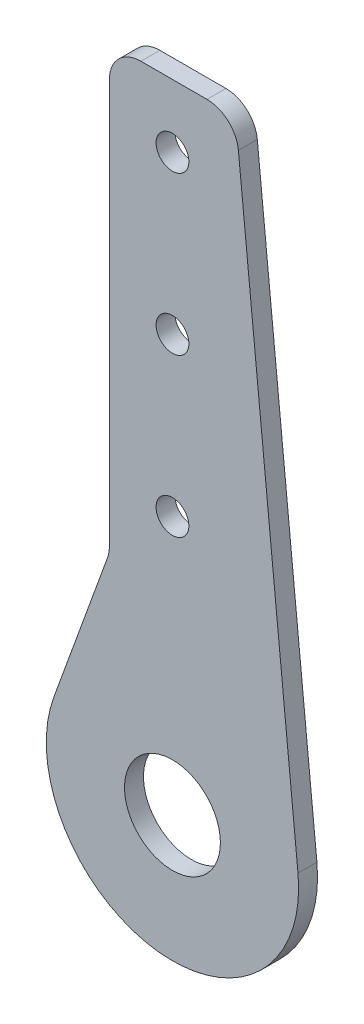
ISO-10303-21;
HEADER;
FILE_DESCRIPTION(('STEP AP214'),'2;1');
FILE_NAME('part.step','',(''),(''),'','','');
FILE_SCHEMA(('AUTOMOTIVE_DESIGN { 1 0 10303 214 1 1 1 1 }'));
ENDSEC;
DATA;
#1=APPLICATION_CONTEXT('core data for automotive mechanical design processes');
#2=APPLICATION_PROTOCOL_DEFINITION('international standard','automotive_design',2000,#1);
#3=PRODUCT_CONTEXT('',#1,'mechanical');
#4=PRODUCT('Part','Part','',(#3));
#5=PRODUCT_RELATED_PRODUCT_CATEGORY('part','',(#4));
#6=PRODUCT_DEFINITION_FORMATION('','',#4);
#7=PRODUCT_DEFINITION_CONTEXT('part definition',#1,'design');
#8=PRODUCT_DEFINITION('design','',#6,#7);
#9=PRODUCT_DEFINITION_SHAPE('','',#8);
#10=(LENGTH_UNIT() NAMED_UNIT(*) SI_UNIT(.MILLI.,.METRE.));
#11=(NAMED_UNIT(*) PLANE_ANGLE_UNIT() SI_UNIT($,.RADIAN.));
#12=(NAMED_UNIT(*) SI_UNIT($,.STERADIAN.) SOLID_ANGLE_UNIT());
#13=UNCERTAINTY_MEASURE_WITH_UNIT(LENGTH_MEASURE(1.E-05),#10,'distance_accuracy_value','');
#14=(GEOMETRIC_REPRESENTATION_CONTEXT(3) GLOBAL_UNCERTAINTY_ASSIGNED_CONTEXT((#13)) GLOBAL_UNIT_ASSIGNED_CONTEXT((#10,
#11,#12)) REPRESENTATION_CONTEXT('',''));
#15=CARTESIAN_POINT('',(0.,0.,0.));
#16=DIRECTION('',(0.,0.,1.));
#17=DIRECTION('',(1.,0.,0.));
#18=AXIS2_PLACEMENT_3D('',#15,#16,#17);
#19=CARTESIAN_POINT('',(0.,0.,3.));
#20=DIRECTION('',(0.,0.,1.));
#21=DIRECTION('',(1.,0.,0.));
#22=AXIS2_PLACEMENT_3D('',#19,#20,#21);
#23=PLANE('',#22);
#24=CARTESIAN_POINT('',(0.,91.,3.));
#25=DIRECTION('',(0.,0.,1.));
#26=DIRECTION('',(1.,0.,0.));
#27=AXIS2_PLACEMENT_3D('',#24,#25,#26);
#28=CIRCLE('',#27,2.59999999999997);
#29=CARTESIAN_POINT('',(2.59999999999997,91.,3.));
#30=VERTEX_POINT('',#29);
#31=EDGE_CURVE('E266',#30,#30,#28,.T.);
#32=ORIENTED_EDGE('',*,*,#31,.F.);
#33=EDGE_LOOP('',(#32));
#34=FACE_BOUND('',#33,.T.);
#35=CARTESIAN_POINT('',(0.,0.,3.));
#36=DIRECTION('',(0.,0.,1.));
#37=DIRECTION('',(1.,0.,0.));
#38=AXIS2_PLACEMENT_3D('',#35,#36,#37);
#39=CIRCLE('',#38,7.6);
#40=CARTESIAN_POINT('',(7.6,0.,3.));
#41=VERTEX_POINT('',#40);
#42=EDGE_CURVE('E147',#41,#41,#39,.T.);
#43=ORIENTED_EDGE('',*,*,#42,.F.);
#44=EDGE_LOOP('',(#43));
#45=FACE_BOUND('',#44,.T.);
#46=DIRECTION('',(-0.099501243789102,0.995037437730069,0.));
#47=VECTOR('',#46,1.);
#48=CARTESIAN_POINT('',(9.99999999999999,101.,3.));
#49=LINE('',#48,#47);
#50=CARTESIAN_POINT('',(19.9007487546014,1.99002487578204,3.));
#51=VERTEX_POINT('',#50);
#52=CARTESIAN_POINT('',(10.4502380658055,96.4975062189455,3.));
#53=VERTEX_POINT('',#52);
#54=EDGE_CURVE('E136',#51,#53,#49,.T.);
#55=ORIENTED_EDGE('',*,*,#54,.T.);
#56=CARTESIAN_POINT('',(5.47505087715512,96.,3.));
#57=DIRECTION('',(0.,0.,1.));
#58=DIRECTION('',(1.,0.,0.));
#59=AXIS2_PLACEMENT_3D('',#56,#57,#58);
#60=CIRCLE('',#59,5.);
#61=CARTESIAN_POINT('',(5.47505087715512,101.,3.));
#62=VERTEX_POINT('',#61);
#63=EDGE_CURVE('E180',#53,#62,#60,.T.);
#64=ORIENTED_EDGE('',*,*,#63,.T.);
#65=DIRECTION('',(-1.,0.,0.));
#66=VECTOR('',#65,1.);
#67=CARTESIAN_POINT('',(-10.,101.,3.));
#68=LINE('',#67,#66);
#69=CARTESIAN_POINT('',(-5.00000000000001,101.,3.));
#70=VERTEX_POINT('',#69);
#71=EDGE_CURVE('E159',#62,#70,#68,.T.);
#72=ORIENTED_EDGE('',*,*,#71,.T.);
#73=CARTESIAN_POINT('',(-5.00000000000001,96.,3.));
#74=DIRECTION('',(0.,0.,1.));
#75=DIRECTION('',(1.,0.,0.));
#76=AXIS2_PLACEMENT_3D('',#73,#74,#75);
#77=CIRCLE('',#76,5.);
#78=CARTESIAN_POINT('',(-10.,96.,3.));
#79=VERTEX_POINT('',#78);
#80=EDGE_CURVE('E177',#70,#79,#77,.T.);
#81=ORIENTED_EDGE('',*,*,#80,.T.);
#82=DIRECTION('',(0.,-1.,0.));
#83=VECTOR('',#82,1.);
#84=CARTESIAN_POINT('',(-10.,101.,3.));
#85=LINE('',#84,#83);
#86=CARTESIAN_POINT('',(-10.,31.8816799559392,3.));
#87=VERTEX_POINT('',#86);
#88=EDGE_CURVE('E119',#79,#87,#85,.T.);
#89=ORIENTED_EDGE('',*,*,#88,.T.);
#90=CARTESIAN_POINT('',(-15.,31.8816799559392,3.));
#91=DIRECTION('',(0.,0.,1.));
#92=DIRECTION('',(1.,0.,0.));
#93=AXIS2_PLACEMENT_3D('',#90,#91,#92);
#94=CIRCLE('',#93,5.);
#95=CARTESIAN_POINT('',(-10.3015667851305,30.1714971220261,3.));
#96=VERTEX_POINT('',#95);
#97=EDGE_CURVE('E11',#87,#96,#94,.F.);
#98=ORIENTED_EDGE('',*,*,#97,.T.);
#99=DIRECTION('',(-0.342036566782612,-0.939686642973903,0.));
#100=VECTOR('',#99,1.);
#101=CARTESIAN_POINT('',(-10.,31.,3.));
#102=LINE('',#101,#100);
#103=CARTESIAN_POINT('',(-18.7937328594781,6.84073133565224,3.));
#104=VERTEX_POINT('',#103);
#105=EDGE_CURVE('E108',#96,#104,#102,.T.);
#106=ORIENTED_EDGE('',*,*,#105,.T.);
#107=CARTESIAN_POINT('',(0.,0.,3.));
#108=DIRECTION('',(0.,0.,1.));
#109=DIRECTION('',(1.,0.,0.));
#110=AXIS2_PLACEMENT_3D('',#107,#108,#109);
#111=CIRCLE('',#110,20.);
#112=EDGE_CURVE('E113',#104,#51,#111,.T.);
#113=ORIENTED_EDGE('',*,*,#112,.T.);
#114=EDGE_LOOP('',(#55,#64,#72,#81,#89,#98,#106,#113));
#115=FACE_BOUND('',#114,.T.);
#116=CARTESIAN_POINT('',(0.,66.,3.));
#117=DIRECTION('',(0.,0.,1.));
#118=DIRECTION('',(1.,0.,0.));
#119=AXIS2_PLACEMENT_3D('',#116,#117,#118);
#120=CIRCLE('',#119,2.59999999999998);
#121=CARTESIAN_POINT('',(2.59999999999998,66.,3.));
#122=VERTEX_POINT('',#121);
#123=EDGE_CURVE('E258',#122,#122,#120,.T.);
#124=ORIENTED_EDGE('',*,*,#123,.F.);
#125=EDGE_LOOP('',(#124));
#126=FACE_BOUND('',#125,.T.);
#127=CARTESIAN_POINT('',(0.,41.,3.));
#128=DIRECTION('',(0.,0.,1.));
#129=DIRECTION('',(1.,0.,0.));
#130=AXIS2_PLACEMENT_3D('',#127,#128,#129);
#131=CIRCLE('',#130,2.59999999999999);
#132=CARTESIAN_POINT('',(2.59999999999998,41.,3.));
#133=VERTEX_POINT('',#132);
#134=EDGE_CURVE('E274',#133,#133,#131,.T.);
#135=ORIENTED_EDGE('',*,*,#134,.F.);
#136=EDGE_LOOP('',(#135));
#137=FACE_BOUND('',#136,.T.);
#138=ADVANCED_FACE('F45',(#34,#45,#115,#126,#137),#23,.T.);
#139=CARTESIAN_POINT('',(0.,0.,0.));
#140=DIRECTION('',(0.,0.,1.));
#141=DIRECTION('',(1.,0.,0.));
#142=AXIS2_PLACEMENT_3D('',#139,#140,#141);
#143=PLANE('',#142);
#144=DIRECTION('',(-1.,0.,0.));
#145=VECTOR('',#144,1.);
#146=CARTESIAN_POINT('',(-10.,101.,0.));
#147=LINE('',#146,#145);
#148=CARTESIAN_POINT('',(5.47505087715512,101.,0.));
#149=VERTEX_POINT('',#148);
#150=CARTESIAN_POINT('',(-5.00000000000001,101.,0.));
#151=VERTEX_POINT('',#150);
#152=EDGE_CURVE('E142',#149,#151,#147,.T.);
#153=ORIENTED_EDGE('',*,*,#152,.F.);
#154=CARTESIAN_POINT('',(5.47505087715512,96.,0.));
#155=DIRECTION('',(0.,0.,1.));
#156=DIRECTION('',(1.,0.,0.));
#157=AXIS2_PLACEMENT_3D('',#154,#155,#156);
#158=CIRCLE('',#157,5.);
#159=CARTESIAN_POINT('',(10.4502380658055,96.4975062189455,0.));
#160=VERTEX_POINT('',#159);
#161=EDGE_CURVE('E171',#149,#160,#158,.F.);
#162=ORIENTED_EDGE('',*,*,#161,.T.);
#163=DIRECTION('',(-0.099501243789102,0.995037437730069,0.));
#164=VECTOR('',#163,1.);
#165=CARTESIAN_POINT('',(9.99999999999999,101.,0.));
#166=LINE('',#165,#164);
#167=CARTESIAN_POINT('',(19.9007487546014,1.99002487578204,0.));
#168=VERTEX_POINT('',#167);
#169=EDGE_CURVE('E155',#168,#160,#166,.T.);
#170=ORIENTED_EDGE('',*,*,#169,.F.);
#171=CARTESIAN_POINT('',(0.,0.,0.));
#172=DIRECTION('',(0.,0.,1.));
#173=DIRECTION('',(1.,0.,0.));
#174=AXIS2_PLACEMENT_3D('',#171,#172,#173);
#175=CIRCLE('',#174,20.);
#176=CARTESIAN_POINT('',(-18.7937328594781,6.84073133565224,0.));
#177=VERTEX_POINT('',#176);
#178=EDGE_CURVE('E152',#177,#168,#175,.T.);
#179=ORIENTED_EDGE('',*,*,#178,.F.);
#180=DIRECTION('',(-0.342036566782612,-0.939686642973903,0.));
#181=VECTOR('',#180,1.);
#182=CARTESIAN_POINT('',(-10.,31.,0.));
#183=LINE('',#182,#181);
#184=CARTESIAN_POINT('',(-10.3015667851305,30.1714971220261,0.));
#185=VERTEX_POINT('',#184);
#186=EDGE_CURVE('E125',#185,#177,#183,.T.);
#187=ORIENTED_EDGE('',*,*,#186,.F.);
#188=CARTESIAN_POINT('',(-15.,31.8816799559392,0.));
#189=DIRECTION('',(0.,0.,1.));
#190=DIRECTION('',(1.,0.,0.));
#191=AXIS2_PLACEMENT_3D('',#188,#189,#190);
#192=CIRCLE('',#191,5.);
#193=CARTESIAN_POINT('',(-10.,31.8816799559392,0.));
#194=VERTEX_POINT('',#193);
#195=EDGE_CURVE('E54',#185,#194,#192,.T.);
#196=ORIENTED_EDGE('',*,*,#195,.T.);
#197=DIRECTION('',(0.,-1.,0.));
#198=VECTOR('',#197,1.);
#199=CARTESIAN_POINT('',(-10.,101.,0.));
#200=LINE('',#199,#198);
#201=CARTESIAN_POINT('',(-10.,96.,0.));
#202=VERTEX_POINT('',#201);
#203=EDGE_CURVE('E146',#202,#194,#200,.T.);
#204=ORIENTED_EDGE('',*,*,#203,.F.);
#205=CARTESIAN_POINT('',(-5.00000000000001,96.,0.));
#206=DIRECTION('',(0.,0.,1.));
#207=DIRECTION('',(1.,0.,0.));
#208=AXIS2_PLACEMENT_3D('',#205,#206,#207);
#209=CIRCLE('',#208,5.);
#210=EDGE_CURVE('E168',#202,#151,#209,.F.);
#211=ORIENTED_EDGE('',*,*,#210,.T.);
#212=EDGE_LOOP('',(#153,#162,#170,#179,#187,#196,#204,#211));
#213=FACE_BOUND('',#212,.T.);
#214=CARTESIAN_POINT('',(0.,0.,0.));
#215=DIRECTION('',(0.,0.,1.));
#216=DIRECTION('',(1.,0.,0.));
#217=AXIS2_PLACEMENT_3D('',#214,#215,#216);
#218=CIRCLE('',#217,7.6);
#219=CARTESIAN_POINT('',(7.6,0.,0.));
#220=VERTEX_POINT('',#219);
#221=EDGE_CURVE('E254',#220,#220,#218,.T.);
#222=ORIENTED_EDGE('',*,*,#221,.T.);
#223=EDGE_LOOP('',(#222));
#224=FACE_BOUND('',#223,.T.);
#225=CARTESIAN_POINT('',(0.,66.,0.));
#226=DIRECTION('',(0.,0.,1.));
#227=DIRECTION('',(1.,0.,0.));
#228=AXIS2_PLACEMENT_3D('',#225,#226,#227);
#229=CIRCLE('',#228,2.59999999999998);
#230=CARTESIAN_POINT('',(2.59999999999998,66.,0.));
#231=VERTEX_POINT('',#230);
#232=EDGE_CURVE('E262',#231,#231,#229,.T.);
#233=ORIENTED_EDGE('',*,*,#232,.T.);
#234=EDGE_LOOP('',(#233));
#235=FACE_BOUND('',#234,.T.);
#236=CARTESIAN_POINT('',(0.,91.,0.));
#237=DIRECTION('',(0.,0.,1.));
#238=DIRECTION('',(1.,0.,0.));
#239=AXIS2_PLACEMENT_3D('',#236,#237,#238);
#240=CIRCLE('',#239,2.59999999999997);
#241=CARTESIAN_POINT('',(2.59999999999997,91.,0.));
#242=VERTEX_POINT('',#241);
#243=EDGE_CURVE('E270',#242,#242,#240,.T.);
#244=ORIENTED_EDGE('',*,*,#243,.T.);
#245=EDGE_LOOP('',(#244));
#246=FACE_BOUND('',#245,.T.);
#247=CARTESIAN_POINT('',(0.,41.,0.));
#248=DIRECTION('',(0.,0.,1.));
#249=DIRECTION('',(1.,0.,0.));
#250=AXIS2_PLACEMENT_3D('',#247,#248,#249);
#251=CIRCLE('',#250,2.59999999999999);
#252=CARTESIAN_POINT('',(2.59999999999998,41.,0.));
#253=VERTEX_POINT('',#252);
#254=EDGE_CURVE('E278',#253,#253,#251,.T.);
#255=ORIENTED_EDGE('',*,*,#254,.T.);
#256=EDGE_LOOP('',(#255));
#257=FACE_BOUND('',#256,.T.);
#258=ADVANCED_FACE('F195',(#213,#224,#235,#246,#257),#143,.F.);
#259=CARTESIAN_POINT('',(-10.,101.,3.));
#260=DIRECTION('',(0.,-1.,0.));
#261=DIRECTION('',(0.,0.,-1.));
#262=AXIS2_PLACEMENT_3D('',#259,#260,#261);
#263=PLANE('',#262);
#264=ORIENTED_EDGE('',*,*,#71,.F.);
#265=DIRECTION('',(0.,0.,-1.));
#266=VECTOR('',#265,1.);
#267=CARTESIAN_POINT('',(5.47505087715512,101.,3.));
#268=LINE('',#267,#266);
#269=EDGE_CURVE('E164',#62,#149,#268,.T.);
#270=ORIENTED_EDGE('',*,*,#269,.T.);
#271=ORIENTED_EDGE('',*,*,#152,.T.);
#272=DIRECTION('',(0.,0.,-1.));
#273=VECTOR('',#272,1.);
#274=CARTESIAN_POINT('',(-5.00000000000001,101.,3.));
#275=LINE('',#274,#273);
#276=EDGE_CURVE('E129',#151,#70,#275,.F.);
#277=ORIENTED_EDGE('',*,*,#276,.T.);
#278=EDGE_LOOP('',(#264,#270,#271,#277));
#279=FACE_BOUND('',#278,.T.);
#280=ADVANCED_FACE('F214',(#279),#263,.F.);
#281=CARTESIAN_POINT('',(-10.,101.,3.));
#282=DIRECTION('',(1.,0.,0.));
#283=DIRECTION('',(0.,1.,0.));
#284=AXIS2_PLACEMENT_3D('',#281,#282,#283);
#285=PLANE('',#284);
#286=ORIENTED_EDGE('',*,*,#88,.F.);
#287=DIRECTION('',(0.,0.,-1.));
#288=VECTOR('',#287,1.);
#289=CARTESIAN_POINT('',(-10.,96.,3.));
#290=LINE('',#289,#288);
#291=EDGE_CURVE('E185',#79,#202,#290,.T.);
#292=ORIENTED_EDGE('',*,*,#291,.T.);
#293=ORIENTED_EDGE('',*,*,#203,.T.);
#294=DIRECTION('',(0.,0.,-1.));
#295=VECTOR('',#294,1.);
#296=CARTESIAN_POINT('',(-10.,31.8816799559392,3.));
#297=LINE('',#296,#295);
#298=EDGE_CURVE('E67',#194,#87,#297,.F.);
#299=ORIENTED_EDGE('',*,*,#298,.T.);
#300=EDGE_LOOP('',(#286,#292,#293,#299));
#301=FACE_BOUND('',#300,.T.);
#302=ADVANCED_FACE('F198',(#301),#285,.F.);
#303=CARTESIAN_POINT('',(-10.,31.,3.));
#304=DIRECTION('',(0.939686642973903,-0.342036566782612,0.));
#305=DIRECTION('',(0.342036566782612,0.939686642973903,0.));
#306=AXIS2_PLACEMENT_3D('',#303,#304,#305);
#307=PLANE('',#306);
#308=ORIENTED_EDGE('',*,*,#105,.F.);
#309=DIRECTION('',(0.,0.,-1.));
#310=VECTOR('',#309,1.);
#311=CARTESIAN_POINT('',(-10.3015667851305,30.1714971220261,0.));
#312=LINE('',#311,#310);
#313=EDGE_CURVE('E189',#96,#185,#312,.T.);
#314=ORIENTED_EDGE('',*,*,#313,.T.);
#315=ORIENTED_EDGE('',*,*,#186,.T.);
#316=DIRECTION('',(0.,0.,-1.));
#317=VECTOR('',#316,1.);
#318=CARTESIAN_POINT('',(-18.7937328594781,6.84073133565224,3.));
#319=LINE('',#318,#317);
#320=EDGE_CURVE('E122',#104,#177,#319,.T.);
#321=ORIENTED_EDGE('',*,*,#320,.F.);
#322=EDGE_LOOP('',(#308,#314,#315,#321));
#323=FACE_BOUND('',#322,.T.);
#324=ADVANCED_FACE('F123',(#323),#307,.F.);
#325=CARTESIAN_POINT('',(0.,0.,3.));
#326=DIRECTION('',(0.,0.,-1.));
#327=DIRECTION('',(-1.,0.,0.));
#328=AXIS2_PLACEMENT_3D('',#325,#326,#327);
#329=CYLINDRICAL_SURFACE('',#328,20.);
#330=ORIENTED_EDGE('',*,*,#178,.T.);
#331=DIRECTION('',(0.,0.,-1.));
#332=VECTOR('',#331,1.);
#333=CARTESIAN_POINT('',(19.9007487546014,1.99002487578204,3.));
#334=LINE('',#333,#332);
#335=EDGE_CURVE('E130',#51,#168,#334,.T.);
#336=ORIENTED_EDGE('',*,*,#335,.F.);
#337=ORIENTED_EDGE('',*,*,#112,.F.);
#338=ORIENTED_EDGE('',*,*,#320,.T.);
#339=EDGE_LOOP('',(#330,#336,#337,#338));
#340=FACE_BOUND('',#339,.T.);
#341=ADVANCED_FACE('F132',(#340),#329,.T.);
#342=CARTESIAN_POINT('',(9.99999999999999,101.,3.));
#343=DIRECTION('',(-0.995037437730069,-0.099501243789102,0.));
#344=DIRECTION('',(0.099501243789102,-0.995037437730069,0.));
#345=AXIS2_PLACEMENT_3D('',#342,#343,#344);
#346=PLANE('',#345);
#347=ORIENTED_EDGE('',*,*,#169,.T.);
#348=DIRECTION('',(0.,0.,-1.));
#349=VECTOR('',#348,1.);
#350=CARTESIAN_POINT('',(10.4502380658055,96.4975062189455,3.));
#351=LINE('',#350,#349);
#352=EDGE_CURVE('E174',#160,#53,#351,.F.);
#353=ORIENTED_EDGE('',*,*,#352,.T.);
#354=ORIENTED_EDGE('',*,*,#54,.F.);
#355=ORIENTED_EDGE('',*,*,#335,.T.);
#356=EDGE_LOOP('',(#347,#353,#354,#355));
#357=FACE_BOUND('',#356,.T.);
#358=ADVANCED_FACE('F222',(#357),#346,.F.);
#359=CARTESIAN_POINT('',(0.,0.,3.));
#360=DIRECTION('',(0.,0.,-1.));
#361=DIRECTION('',(-1.,0.,0.));
#362=AXIS2_PLACEMENT_3D('',#359,#360,#361);
#363=CYLINDRICAL_SURFACE('',#362,7.6);
#364=ORIENTED_EDGE('',*,*,#42,.T.);
#365=EDGE_LOOP('',(#364));
#366=FACE_BOUND('',#365,.T.);
#367=ORIENTED_EDGE('',*,*,#221,.F.);
#368=EDGE_LOOP('',(#367));
#369=FACE_BOUND('',#368,.T.);
#370=ADVANCED_FACE('F219',(#366,#369),#363,.F.);
#371=CARTESIAN_POINT('',(0.,66.,3.));
#372=DIRECTION('',(0.,0.,-1.));
#373=DIRECTION('',(-1.,0.,0.));
#374=AXIS2_PLACEMENT_3D('',#371,#372,#373);
#375=CYLINDRICAL_SURFACE('',#374,2.59999999999998);
#376=ORIENTED_EDGE('',*,*,#123,.T.);
#377=EDGE_LOOP('',(#376));
#378=FACE_BOUND('',#377,.T.);
#379=ORIENTED_EDGE('',*,*,#232,.F.);
#380=EDGE_LOOP('',(#379));
#381=FACE_BOUND('',#380,.T.);
#382=ADVANCED_FACE('F292',(#378,#381),#375,.F.);
#383=CARTESIAN_POINT('',(0.,91.,3.));
#384=DIRECTION('',(0.,0.,-1.));
#385=DIRECTION('',(-1.,0.,0.));
#386=AXIS2_PLACEMENT_3D('',#383,#384,#385);
#387=CYLINDRICAL_SURFACE('',#386,2.59999999999997);
#388=ORIENTED_EDGE('',*,*,#31,.T.);
#389=EDGE_LOOP('',(#388));
#390=FACE_BOUND('',#389,.T.);
#391=ORIENTED_EDGE('',*,*,#243,.F.);
#392=EDGE_LOOP('',(#391));
#393=FACE_BOUND('',#392,.T.);
#394=ADVANCED_FACE('F240',(#390,#393),#387,.F.);
#395=CARTESIAN_POINT('',(0.,41.,3.));
#396=DIRECTION('',(0.,0.,-1.));
#397=DIRECTION('',(-1.,0.,0.));
#398=AXIS2_PLACEMENT_3D('',#395,#396,#397);
#399=CYLINDRICAL_SURFACE('',#398,2.59999999999999);
#400=ORIENTED_EDGE('',*,*,#134,.T.);
#401=EDGE_LOOP('',(#400));
#402=FACE_BOUND('',#401,.T.);
#403=ORIENTED_EDGE('',*,*,#254,.F.);
#404=EDGE_LOOP('',(#403));
#405=FACE_BOUND('',#404,.T.);
#406=ADVANCED_FACE('F236',(#402,#405),#399,.F.);
#407=CARTESIAN_POINT('',(5.47505087715512,96.,3.));
#408=DIRECTION('',(0.,0.,-1.));
#409=DIRECTION('',(-1.,0.,0.));
#410=AXIS2_PLACEMENT_3D('',#407,#408,#409);
#411=CYLINDRICAL_SURFACE('',#410,5.);
#412=ORIENTED_EDGE('',*,*,#63,.F.);
#413=ORIENTED_EDGE('',*,*,#352,.F.);
#414=ORIENTED_EDGE('',*,*,#161,.F.);
#415=ORIENTED_EDGE('',*,*,#269,.F.);
#416=EDGE_LOOP('',(#412,#413,#414,#415));
#417=FACE_BOUND('',#416,.T.);
#418=ADVANCED_FACE('F205',(#417),#411,.T.);
#419=CARTESIAN_POINT('',(-5.00000000000001,96.,3.));
#420=DIRECTION('',(0.,0.,-1.));
#421=DIRECTION('',(-1.,0.,0.));
#422=AXIS2_PLACEMENT_3D('',#419,#420,#421);
#423=CYLINDRICAL_SURFACE('',#422,5.);
#424=ORIENTED_EDGE('',*,*,#80,.F.);
#425=ORIENTED_EDGE('',*,*,#276,.F.);
#426=ORIENTED_EDGE('',*,*,#210,.F.);
#427=ORIENTED_EDGE('',*,*,#291,.F.);
#428=EDGE_LOOP('',(#424,#425,#426,#427));
#429=FACE_BOUND('',#428,.T.);
#430=ADVANCED_FACE('F201',(#429),#423,.T.);
#431=CARTESIAN_POINT('',(-15.,31.8816799559392,3.));
#432=DIRECTION('',(0.,0.,1.));
#433=DIRECTION('',(1.,0.,0.));
#434=AXIS2_PLACEMENT_3D('',#431,#432,#433);
#435=CYLINDRICAL_SURFACE('',#434,5.);
#436=ORIENTED_EDGE('',*,*,#97,.F.);
#437=ORIENTED_EDGE('',*,*,#298,.F.);
#438=ORIENTED_EDGE('',*,*,#195,.F.);
#439=ORIENTED_EDGE('',*,*,#313,.F.);
#440=EDGE_LOOP('',(#436,#437,#438,#439));
#441=FACE_BOUND('',#440,.T.);
#442=ADVANCED_FACE('F47',(#441),#435,.F.);
#443=CLOSED_SHELL('',(#138,#258,#280,#302,#324,#341,#358,#370,#382,#394,#406,#418,#430,#442));
#444=MANIFOLD_SOLID_BREP('B2',#443);
#445=ADVANCED_BREP_SHAPE_REPRESENTATION('',(#18,#444),#14);
#446=SHAPE_DEFINITION_REPRESENTATION(#9,#445);
ENDSEC;
END-ISO-10303-21;
